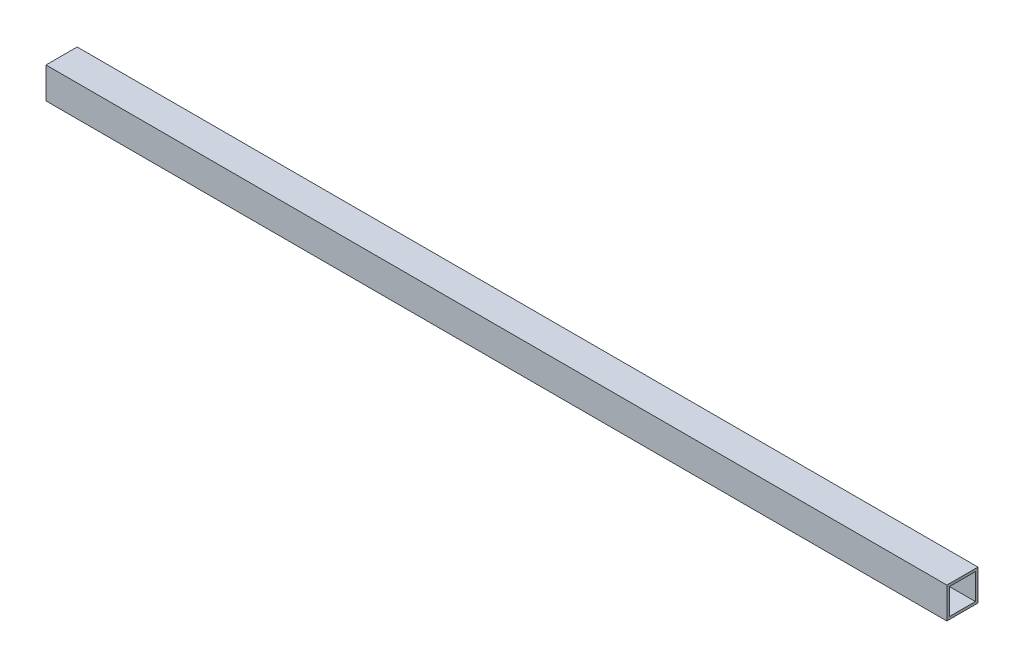
ISO-10303-21;
HEADER;
FILE_DESCRIPTION(('STEP AP214'),'2;1');
FILE_NAME('part.step','',(''),(''),'','','');
FILE_SCHEMA(('AUTOMOTIVE_DESIGN { 1 0 10303 214 1 1 1 1 }'));
ENDSEC;
DATA;
#1=APPLICATION_CONTEXT('core data for automotive mechanical design processes');
#2=APPLICATION_PROTOCOL_DEFINITION('international standard','automotive_design',2000,#1);
#3=PRODUCT_CONTEXT('',#1,'mechanical');
#4=PRODUCT('Part','Part','',(#3));
#5=PRODUCT_RELATED_PRODUCT_CATEGORY('part','',(#4));
#6=PRODUCT_DEFINITION_FORMATION('','',#4);
#7=PRODUCT_DEFINITION_CONTEXT('part definition',#1,'design');
#8=PRODUCT_DEFINITION('design','',#6,#7);
#9=PRODUCT_DEFINITION_SHAPE('','',#8);
#10=(LENGTH_UNIT() NAMED_UNIT(*) SI_UNIT(.MILLI.,.METRE.));
#11=(NAMED_UNIT(*) PLANE_ANGLE_UNIT() SI_UNIT($,.RADIAN.));
#12=(NAMED_UNIT(*) SI_UNIT($,.STERADIAN.) SOLID_ANGLE_UNIT());
#13=UNCERTAINTY_MEASURE_WITH_UNIT(LENGTH_MEASURE(1.E-05),#10,'distance_accuracy_value','');
#14=(GEOMETRIC_REPRESENTATION_CONTEXT(3) GLOBAL_UNCERTAINTY_ASSIGNED_CONTEXT((#13)) GLOBAL_UNIT_ASSIGNED_CONTEXT((#10,
#11,#12)) REPRESENTATION_CONTEXT('',''));
#15=CARTESIAN_POINT('',(0.,0.,0.));
#16=DIRECTION('',(0.,0.,1.));
#17=DIRECTION('',(1.,0.,0.));
#18=AXIS2_PLACEMENT_3D('',#15,#16,#17);
#19=CARTESIAN_POINT('',(1101.725,0.,0.));
#20=DIRECTION('',(0.,1.,0.));
#21=DIRECTION('',(0.,0.,1.));
#22=AXIS2_PLACEMENT_3D('',#19,#20,#21);
#23=PLANE('',#22);
#24=DIRECTION('',(0.,0.,-1.));
#25=VECTOR('',#24,1.);
#26=CARTESIAN_POINT('',(0.,0.,0.));
#27=LINE('',#26,#25);
#28=CARTESIAN_POINT('',(0.,0.,0.));
#29=VERTEX_POINT('',#28);
#30=CARTESIAN_POINT('',(0.,0.,-38.1));
#31=VERTEX_POINT('',#30);
#32=EDGE_CURVE('E172',#29,#31,#27,.T.);
#33=ORIENTED_EDGE('',*,*,#32,.T.);
#34=DIRECTION('',(-1.,0.,0.));
#35=VECTOR('',#34,1.);
#36=CARTESIAN_POINT('',(1101.725,0.,-38.1));
#37=LINE('',#36,#35);
#38=CARTESIAN_POINT('',(1101.725,0.,-38.1));
#39=VERTEX_POINT('',#38);
#40=EDGE_CURVE('E45',#39,#31,#37,.T.);
#41=ORIENTED_EDGE('',*,*,#40,.F.);
#42=DIRECTION('',(0.,0.,-1.));
#43=VECTOR('',#42,1.);
#44=CARTESIAN_POINT('',(1101.725,0.,0.));
#45=LINE('',#44,#43);
#46=CARTESIAN_POINT('',(1101.725,0.,0.));
#47=VERTEX_POINT('',#46);
#48=EDGE_CURVE('E158',#47,#39,#45,.T.);
#49=ORIENTED_EDGE('',*,*,#48,.F.);
#50=DIRECTION('',(-1.,0.,0.));
#51=VECTOR('',#50,1.);
#52=CARTESIAN_POINT('',(1101.725,0.,0.));
#53=LINE('',#52,#51);
#54=EDGE_CURVE('E11',#47,#29,#53,.T.);
#55=ORIENTED_EDGE('',*,*,#54,.T.);
#56=EDGE_LOOP('',(#33,#41,#49,#55));
#57=FACE_BOUND('',#56,.T.);
#58=CARTESIAN_POINT('',(869.95,0.,-19.05));
#59=DIRECTION('',(0.,-1.,0.));
#60=DIRECTION('',(0.,0.,-1.));
#61=AXIS2_PLACEMENT_3D('',#58,#59,#60);
#62=CIRCLE('',#61,2.45744999999997);
#63=CARTESIAN_POINT('',(869.95,0.,-21.50745));
#64=VERTEX_POINT('',#63);
#65=EDGE_CURVE('E214',#64,#64,#62,.T.);
#66=ORIENTED_EDGE('',*,*,#65,.F.);
#67=EDGE_LOOP('',(#66));
#68=FACE_BOUND('',#67,.T.);
#69=CARTESIAN_POINT('',(260.35,0.,-19.05));
#70=DIRECTION('',(0.,-1.,0.));
#71=DIRECTION('',(0.,0.,-1.));
#72=AXIS2_PLACEMENT_3D('',#69,#70,#71);
#73=CIRCLE('',#72,2.45744999999997);
#74=CARTESIAN_POINT('',(260.35,0.,-21.50745));
#75=VERTEX_POINT('',#74);
#76=EDGE_CURVE('E217',#75,#75,#73,.T.);
#77=ORIENTED_EDGE('',*,*,#76,.F.);
#78=EDGE_LOOP('',(#77));
#79=FACE_BOUND('',#78,.T.);
#80=ADVANCED_FACE('F36',(#57,#68,#79),#23,.F.);
#81=CARTESIAN_POINT('',(1101.725,0.,0.));
#82=DIRECTION('',(-1.,0.,0.));
#83=DIRECTION('',(0.,0.,1.));
#84=AXIS2_PLACEMENT_3D('',#81,#82,#83);
#85=PLANE('',#84);
#86=DIRECTION('',(0.,-1.,0.));
#87=VECTOR('',#86,1.);
#88=CARTESIAN_POINT('',(1101.725,0.,0.));
#89=LINE('',#88,#87);
#90=CARTESIAN_POINT('',(1101.725,38.1,0.));
#91=VERTEX_POINT('',#90);
#92=EDGE_CURVE('E154',#91,#47,#89,.T.);
#93=ORIENTED_EDGE('',*,*,#92,.T.);
#94=ORIENTED_EDGE('',*,*,#48,.T.);
#95=DIRECTION('',(0.,1.,0.));
#96=VECTOR('',#95,1.);
#97=CARTESIAN_POINT('',(1101.725,0.,-38.1));
#98=LINE('',#97,#96);
#99=CARTESIAN_POINT('',(1101.725,38.1,-38.1));
#100=VERTEX_POINT('',#99);
#101=EDGE_CURVE('E162',#39,#100,#98,.T.);
#102=ORIENTED_EDGE('',*,*,#101,.T.);
#103=DIRECTION('',(0.,0.,1.));
#104=VECTOR('',#103,1.);
#105=CARTESIAN_POINT('',(1101.725,38.1,0.));
#106=LINE('',#105,#104);
#107=EDGE_CURVE('E165',#100,#91,#106,.T.);
#108=ORIENTED_EDGE('',*,*,#107,.T.);
#109=EDGE_LOOP('',(#93,#94,#102,#108));
#110=FACE_BOUND('',#109,.T.);
#111=DIRECTION('',(0.,-1.,0.));
#112=VECTOR('',#111,1.);
#113=CARTESIAN_POINT('',(1101.725,3.175,-3.17500000000001));
#114=LINE('',#113,#112);
#115=CARTESIAN_POINT('',(1101.725,34.925,-3.17500000000001));
#116=VERTEX_POINT('',#115);
#117=CARTESIAN_POINT('',(1101.725,3.175,-3.17500000000001));
#118=VERTEX_POINT('',#117);
#119=EDGE_CURVE('E102',#116,#118,#114,.T.);
#120=ORIENTED_EDGE('',*,*,#119,.F.);
#121=DIRECTION('',(0.,0.,1.));
#122=VECTOR('',#121,1.);
#123=CARTESIAN_POINT('',(1101.725,34.925,-3.17500000000001));
#124=LINE('',#123,#122);
#125=CARTESIAN_POINT('',(1101.725,34.925,-34.925));
#126=VERTEX_POINT('',#125);
#127=EDGE_CURVE('E130',#126,#116,#124,.T.);
#128=ORIENTED_EDGE('',*,*,#127,.F.);
#129=DIRECTION('',(0.,1.,0.));
#130=VECTOR('',#129,1.);
#131=CARTESIAN_POINT('',(1101.725,3.175,-34.925));
#132=LINE('',#131,#130);
#133=CARTESIAN_POINT('',(1101.725,3.175,-34.925));
#134=VERTEX_POINT('',#133);
#135=EDGE_CURVE('E125',#134,#126,#132,.T.);
#136=ORIENTED_EDGE('',*,*,#135,.F.);
#137=DIRECTION('',(0.,0.,-1.));
#138=VECTOR('',#137,1.);
#139=CARTESIAN_POINT('',(1101.725,3.175,-3.17500000000001));
#140=LINE('',#139,#138);
#141=EDGE_CURVE('E111',#118,#134,#140,.T.);
#142=ORIENTED_EDGE('',*,*,#141,.F.);
#143=EDGE_LOOP('',(#120,#128,#136,#142));
#144=FACE_BOUND('',#143,.T.);
#145=ADVANCED_FACE('F124',(#110,#144),#85,.F.);
#146=CARTESIAN_POINT('',(0.,0.,0.));
#147=DIRECTION('',(-1.,0.,0.));
#148=DIRECTION('',(0.,0.,1.));
#149=AXIS2_PLACEMENT_3D('',#146,#147,#148);
#150=PLANE('',#149);
#151=DIRECTION('',(0.,-1.,0.));
#152=VECTOR('',#151,1.);
#153=CARTESIAN_POINT('',(0.,0.,0.));
#154=LINE('',#153,#152);
#155=CARTESIAN_POINT('',(0.,38.1,0.));
#156=VERTEX_POINT('',#155);
#157=EDGE_CURVE('E120',#156,#29,#154,.T.);
#158=ORIENTED_EDGE('',*,*,#157,.F.);
#159=DIRECTION('',(0.,0.,1.));
#160=VECTOR('',#159,1.);
#161=CARTESIAN_POINT('',(0.,38.1,0.));
#162=LINE('',#161,#160);
#163=CARTESIAN_POINT('',(0.,38.1,-38.1));
#164=VERTEX_POINT('',#163);
#165=EDGE_CURVE('E159',#164,#156,#162,.T.);
#166=ORIENTED_EDGE('',*,*,#165,.F.);
#167=DIRECTION('',(0.,1.,0.));
#168=VECTOR('',#167,1.);
#169=CARTESIAN_POINT('',(0.,0.,-38.1));
#170=LINE('',#169,#168);
#171=EDGE_CURVE('E175',#31,#164,#170,.T.);
#172=ORIENTED_EDGE('',*,*,#171,.F.);
#173=ORIENTED_EDGE('',*,*,#32,.F.);
#174=EDGE_LOOP('',(#158,#166,#172,#173));
#175=FACE_BOUND('',#174,.T.);
#176=DIRECTION('',(0.,0.,1.));
#177=VECTOR('',#176,1.);
#178=CARTESIAN_POINT('',(0.,34.925,-3.17500000000001));
#179=LINE('',#178,#177);
#180=CARTESIAN_POINT('',(0.,34.925,-34.925));
#181=VERTEX_POINT('',#180);
#182=CARTESIAN_POINT('',(0.,34.925,-3.17500000000001));
#183=VERTEX_POINT('',#182);
#184=EDGE_CURVE('E112',#181,#183,#179,.T.);
#185=ORIENTED_EDGE('',*,*,#184,.T.);
#186=DIRECTION('',(0.,-1.,0.));
#187=VECTOR('',#186,1.);
#188=CARTESIAN_POINT('',(0.,3.175,-3.17500000000001));
#189=LINE('',#188,#187);
#190=CARTESIAN_POINT('',(0.,3.175,-3.17500000000001));
#191=VERTEX_POINT('',#190);
#192=EDGE_CURVE('E60',#183,#191,#189,.T.);
#193=ORIENTED_EDGE('',*,*,#192,.T.);
#194=DIRECTION('',(0.,0.,-1.));
#195=VECTOR('',#194,1.);
#196=CARTESIAN_POINT('',(0.,3.175,-3.17500000000001));
#197=LINE('',#196,#195);
#198=CARTESIAN_POINT('',(0.,3.175,-34.925));
#199=VERTEX_POINT('',#198);
#200=EDGE_CURVE('E118',#191,#199,#197,.T.);
#201=ORIENTED_EDGE('',*,*,#200,.T.);
#202=DIRECTION('',(0.,1.,0.));
#203=VECTOR('',#202,1.);
#204=CARTESIAN_POINT('',(0.,3.175,-34.925));
#205=LINE('',#204,#203);
#206=EDGE_CURVE('E141',#199,#181,#205,.T.);
#207=ORIENTED_EDGE('',*,*,#206,.T.);
#208=EDGE_LOOP('',(#185,#193,#201,#207));
#209=FACE_BOUND('',#208,.T.);
#210=ADVANCED_FACE('F199',(#175,#209),#150,.T.);
#211=CARTESIAN_POINT('',(1101.725,0.,0.));
#212=DIRECTION('',(0.,0.,-1.));
#213=DIRECTION('',(-1.,0.,0.));
#214=AXIS2_PLACEMENT_3D('',#211,#212,#213);
#215=PLANE('',#214);
#216=ORIENTED_EDGE('',*,*,#157,.T.);
#217=ORIENTED_EDGE('',*,*,#54,.F.);
#218=ORIENTED_EDGE('',*,*,#92,.F.);
#219=DIRECTION('',(-1.,0.,0.));
#220=VECTOR('',#219,1.);
#221=CARTESIAN_POINT('',(1101.725,38.1,0.));
#222=LINE('',#221,#220);
#223=EDGE_CURVE('E168',#91,#156,#222,.T.);
#224=ORIENTED_EDGE('',*,*,#223,.T.);
#225=EDGE_LOOP('',(#216,#217,#218,#224));
#226=FACE_BOUND('',#225,.T.);
#227=ADVANCED_FACE('F38',(#226),#215,.F.);
#228=CARTESIAN_POINT('',(1101.725,0.,-38.1));
#229=DIRECTION('',(0.,0.,1.));
#230=DIRECTION('',(1.,0.,0.));
#231=AXIS2_PLACEMENT_3D('',#228,#229,#230);
#232=PLANE('',#231);
#233=ORIENTED_EDGE('',*,*,#171,.T.);
#234=DIRECTION('',(-1.,0.,0.));
#235=VECTOR('',#234,1.);
#236=CARTESIAN_POINT('',(1101.725,38.1,-38.1));
#237=LINE('',#236,#235);
#238=EDGE_CURVE('E183',#100,#164,#237,.T.);
#239=ORIENTED_EDGE('',*,*,#238,.F.);
#240=ORIENTED_EDGE('',*,*,#101,.F.);
#241=ORIENTED_EDGE('',*,*,#40,.T.);
#242=EDGE_LOOP('',(#233,#239,#240,#241));
#243=FACE_BOUND('',#242,.T.);
#244=ADVANCED_FACE('F193',(#243),#232,.F.);
#245=CARTESIAN_POINT('',(1101.725,38.1,0.));
#246=DIRECTION('',(0.,-1.,0.));
#247=DIRECTION('',(0.,0.,-1.));
#248=AXIS2_PLACEMENT_3D('',#245,#246,#247);
#249=PLANE('',#248);
#250=ORIENTED_EDGE('',*,*,#165,.T.);
#251=ORIENTED_EDGE('',*,*,#223,.F.);
#252=ORIENTED_EDGE('',*,*,#107,.F.);
#253=ORIENTED_EDGE('',*,*,#238,.T.);
#254=EDGE_LOOP('',(#250,#251,#252,#253));
#255=FACE_BOUND('',#254,.T.);
#256=ADVANCED_FACE('F203',(#255),#249,.F.);
#257=CARTESIAN_POINT('',(1101.725,3.175,-3.17500000000001));
#258=DIRECTION('',(0.,0.,-1.));
#259=DIRECTION('',(-1.,0.,0.));
#260=AXIS2_PLACEMENT_3D('',#257,#258,#259);
#261=PLANE('',#260);
#262=ORIENTED_EDGE('',*,*,#192,.F.);
#263=DIRECTION('',(-1.,0.,0.));
#264=VECTOR('',#263,1.);
#265=CARTESIAN_POINT('',(1101.725,34.925,-3.17500000000001));
#266=LINE('',#265,#264);
#267=EDGE_CURVE('E106',#116,#183,#266,.T.);
#268=ORIENTED_EDGE('',*,*,#267,.F.);
#269=ORIENTED_EDGE('',*,*,#119,.T.);
#270=DIRECTION('',(-1.,0.,0.));
#271=VECTOR('',#270,1.);
#272=CARTESIAN_POINT('',(1101.725,3.175,-3.17500000000001));
#273=LINE('',#272,#271);
#274=EDGE_CURVE('E105',#118,#191,#273,.T.);
#275=ORIENTED_EDGE('',*,*,#274,.T.);
#276=EDGE_LOOP('',(#262,#268,#269,#275));
#277=FACE_BOUND('',#276,.T.);
#278=ADVANCED_FACE('F104',(#277),#261,.T.);
#279=CARTESIAN_POINT('',(1101.725,3.175,-3.17500000000001));
#280=DIRECTION('',(0.,1.,0.));
#281=DIRECTION('',(0.,0.,1.));
#282=AXIS2_PLACEMENT_3D('',#279,#280,#281);
#283=PLANE('',#282);
#284=CARTESIAN_POINT('',(260.35,3.175,-19.05));
#285=DIRECTION('',(0.,1.,0.));
#286=DIRECTION('',(0.,0.,1.));
#287=AXIS2_PLACEMENT_3D('',#284,#285,#286);
#288=CIRCLE('',#287,2.45744999999997);
#289=CARTESIAN_POINT('',(260.35,3.175,-16.59255));
#290=VERTEX_POINT('',#289);
#291=EDGE_CURVE('E220',#290,#290,#288,.T.);
#292=ORIENTED_EDGE('',*,*,#291,.F.);
#293=EDGE_LOOP('',(#292));
#294=FACE_BOUND('',#293,.T.);
#295=CARTESIAN_POINT('',(869.95,3.175,-19.05));
#296=DIRECTION('',(0.,1.,0.));
#297=DIRECTION('',(0.,0.,1.));
#298=AXIS2_PLACEMENT_3D('',#295,#296,#297);
#299=CIRCLE('',#298,2.45744999999997);
#300=CARTESIAN_POINT('',(869.95,3.175,-16.59255));
#301=VERTEX_POINT('',#300);
#302=EDGE_CURVE('E138',#301,#301,#299,.T.);
#303=ORIENTED_EDGE('',*,*,#302,.F.);
#304=EDGE_LOOP('',(#303));
#305=FACE_BOUND('',#304,.T.);
#306=ORIENTED_EDGE('',*,*,#200,.F.);
#307=ORIENTED_EDGE('',*,*,#274,.F.);
#308=ORIENTED_EDGE('',*,*,#141,.T.);
#309=DIRECTION('',(-1.,0.,0.));
#310=VECTOR('',#309,1.);
#311=CARTESIAN_POINT('',(1101.725,3.175,-34.925));
#312=LINE('',#311,#310);
#313=EDGE_CURVE('E121',#134,#199,#312,.T.);
#314=ORIENTED_EDGE('',*,*,#313,.T.);
#315=EDGE_LOOP('',(#306,#307,#308,#314));
#316=FACE_BOUND('',#315,.T.);
#317=ADVANCED_FACE('F115',(#294,#305,#316),#283,.T.);
#318=CARTESIAN_POINT('',(1101.725,3.175,-34.925));
#319=DIRECTION('',(0.,0.,1.));
#320=DIRECTION('',(1.,0.,0.));
#321=AXIS2_PLACEMENT_3D('',#318,#319,#320);
#322=PLANE('',#321);
#323=ORIENTED_EDGE('',*,*,#206,.F.);
#324=ORIENTED_EDGE('',*,*,#313,.F.);
#325=ORIENTED_EDGE('',*,*,#135,.T.);
#326=DIRECTION('',(-1.,0.,0.));
#327=VECTOR('',#326,1.);
#328=CARTESIAN_POINT('',(1101.725,34.925,-34.925));
#329=LINE('',#328,#327);
#330=EDGE_CURVE('E52',#126,#181,#329,.T.);
#331=ORIENTED_EDGE('',*,*,#330,.T.);
#332=EDGE_LOOP('',(#323,#324,#325,#331));
#333=FACE_BOUND('',#332,.T.);
#334=ADVANCED_FACE('F236',(#333),#322,.T.);
#335=CARTESIAN_POINT('',(1101.725,34.925,-3.17500000000001));
#336=DIRECTION('',(0.,-1.,0.));
#337=DIRECTION('',(0.,0.,-1.));
#338=AXIS2_PLACEMENT_3D('',#335,#336,#337);
#339=PLANE('',#338);
#340=ORIENTED_EDGE('',*,*,#184,.F.);
#341=ORIENTED_EDGE('',*,*,#330,.F.);
#342=ORIENTED_EDGE('',*,*,#127,.T.);
#343=ORIENTED_EDGE('',*,*,#267,.T.);
#344=EDGE_LOOP('',(#340,#341,#342,#343));
#345=FACE_BOUND('',#344,.T.);
#346=ADVANCED_FACE('F243',(#345),#339,.T.);
#347=CARTESIAN_POINT('',(869.95,0.,-19.05));
#348=DIRECTION('',(0.,-1.,0.));
#349=DIRECTION('',(0.,0.,-1.));
#350=AXIS2_PLACEMENT_3D('',#347,#348,#349);
#351=CYLINDRICAL_SURFACE('',#350,2.45744999999997);
#352=ORIENTED_EDGE('',*,*,#65,.T.);
#353=EDGE_LOOP('',(#352));
#354=FACE_BOUND('',#353,.T.);
#355=ORIENTED_EDGE('',*,*,#302,.T.);
#356=EDGE_LOOP('',(#355));
#357=FACE_BOUND('',#356,.T.);
#358=ADVANCED_FACE('F233',(#354,#357),#351,.F.);
#359=CARTESIAN_POINT('',(260.35,0.,-19.05));
#360=DIRECTION('',(0.,-1.,0.));
#361=DIRECTION('',(0.,0.,-1.));
#362=AXIS2_PLACEMENT_3D('',#359,#360,#361);
#363=CYLINDRICAL_SURFACE('',#362,2.45744999999997);
#364=ORIENTED_EDGE('',*,*,#76,.T.);
#365=EDGE_LOOP('',(#364));
#366=FACE_BOUND('',#365,.T.);
#367=ORIENTED_EDGE('',*,*,#291,.T.);
#368=EDGE_LOOP('',(#367));
#369=FACE_BOUND('',#368,.T.);
#370=ADVANCED_FACE('F289',(#366,#369),#363,.F.);
#371=CLOSED_SHELL('',(#80,#145,#210,#227,#244,#256,#278,#317,#334,#346,#358,#370));
#372=MANIFOLD_SOLID_BREP('B2',#371);
#373=ADVANCED_BREP_SHAPE_REPRESENTATION('',(#18,#372),#14);
#374=SHAPE_DEFINITION_REPRESENTATION(#9,#373);
ENDSEC;
END-ISO-10303-21;
